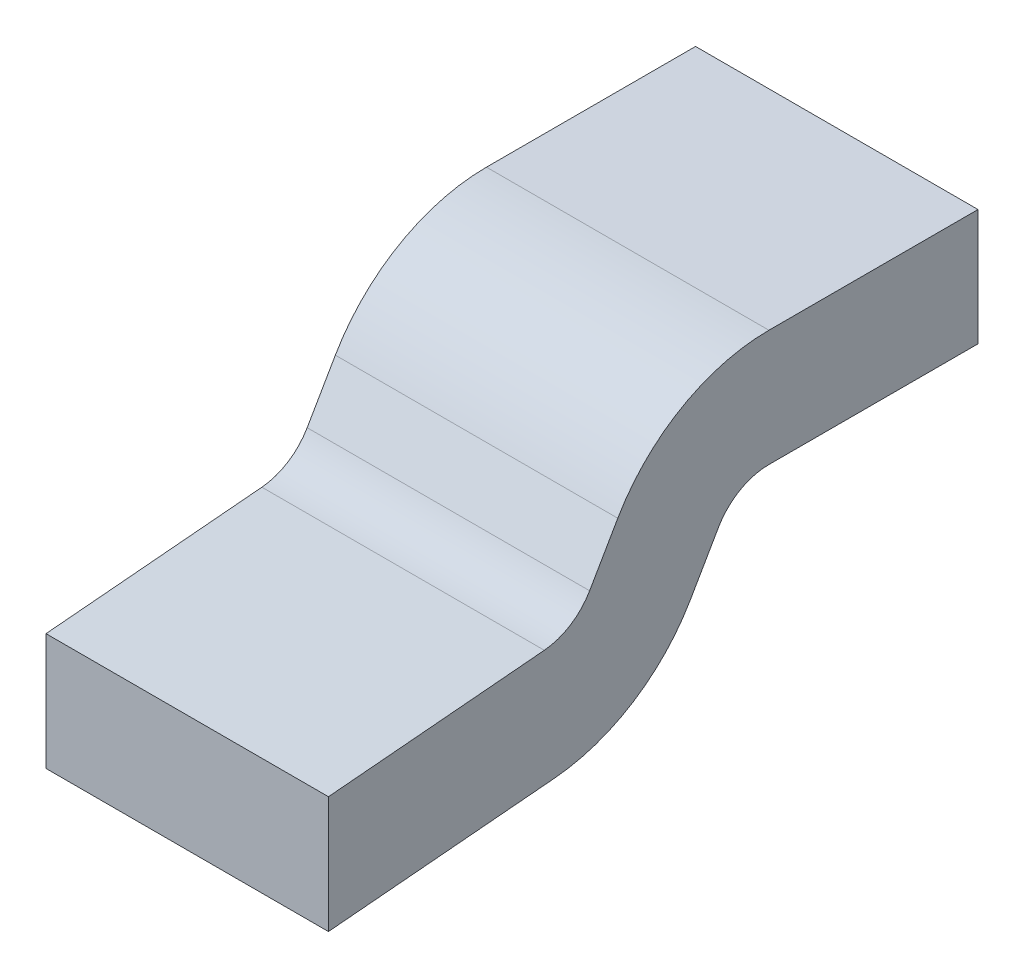
ISO-10303-21;
HEADER;
FILE_DESCRIPTION(('STEP AP214'),'2;1');
FILE_NAME('part.step','',(''),(''),'','','');
FILE_SCHEMA(('AUTOMOTIVE_DESIGN { 1 0 10303 214 1 1 1 1 }'));
ENDSEC;
DATA;
#1=APPLICATION_CONTEXT('core data for automotive mechanical design processes');
#2=APPLICATION_PROTOCOL_DEFINITION('international standard','automotive_design',2000,#1);
#3=PRODUCT_CONTEXT('',#1,'mechanical');
#4=PRODUCT('Part','Part','',(#3));
#5=PRODUCT_RELATED_PRODUCT_CATEGORY('part','',(#4));
#6=PRODUCT_DEFINITION_FORMATION('','',#4);
#7=PRODUCT_DEFINITION_CONTEXT('part definition',#1,'design');
#8=PRODUCT_DEFINITION('design','',#6,#7);
#9=PRODUCT_DEFINITION_SHAPE('','',#8);
#10=(LENGTH_UNIT() NAMED_UNIT(*) SI_UNIT(.MILLI.,.METRE.));
#11=(NAMED_UNIT(*) PLANE_ANGLE_UNIT() SI_UNIT($,.RADIAN.));
#12=(NAMED_UNIT(*) SI_UNIT($,.STERADIAN.) SOLID_ANGLE_UNIT());
#13=UNCERTAINTY_MEASURE_WITH_UNIT(LENGTH_MEASURE(1.E-05),#10,'distance_accuracy_value','');
#14=(GEOMETRIC_REPRESENTATION_CONTEXT(3) GLOBAL_UNCERTAINTY_ASSIGNED_CONTEXT((#13)) GLOBAL_UNIT_ASSIGNED_CONTEXT((#10,
#11,#12)) REPRESENTATION_CONTEXT('',''));
#15=CARTESIAN_POINT('',(0.,0.,0.));
#16=DIRECTION('',(0.,0.,1.));
#17=DIRECTION('',(1.,0.,0.));
#18=AXIS2_PLACEMENT_3D('',#15,#16,#17);
#19=CARTESIAN_POINT('',(-0.37,-0.22,0.9144));
#20=DIRECTION('',(0.,-0.996194698091747,-0.0871557427476379));
#21=DIRECTION('',(0.,0.0871557427476379,-0.996194698091747));
#22=AXIS2_PLACEMENT_3D('',#19,#20,#21);
#23=PLANE('',#22);
#24=DIRECTION('',(0.,0.0871557427476379,-0.996194698091747));
#25=VECTOR('',#24,1.);
#26=CARTESIAN_POINT('',(-0.37,-0.22,0.9144));
#27=LINE('',#26,#25);
#28=CARTESIAN_POINT('',(-0.37,-0.22,0.9144));
#29=VERTEX_POINT('',#28);
#30=CARTESIAN_POINT('',(-0.37,-0.168191562178,0.322226845968));
#31=VERTEX_POINT('',#30);
#32=EDGE_CURVE('E138',#29,#31,#27,.T.);
#33=ORIENTED_EDGE('',*,*,#32,.T.);
#34=DIRECTION('',(1.,0.,0.));
#35=VECTOR('',#34,1.);
#36=CARTESIAN_POINT('',(-0.37,-0.168191562178,0.322226845968));
#37=LINE('',#36,#35);
#38=CARTESIAN_POINT('',(0.37,-0.168191562178,0.322226845968));
#39=VERTEX_POINT('',#38);
#40=EDGE_CURVE('E11',#31,#39,#37,.T.);
#41=ORIENTED_EDGE('',*,*,#40,.T.);
#42=DIRECTION('',(0.,0.0871557427476379,-0.996194698091747));
#43=VECTOR('',#42,1.);
#44=CARTESIAN_POINT('',(0.37,-0.22,0.9144));
#45=LINE('',#44,#43);
#46=CARTESIAN_POINT('',(0.37,-0.22,0.9144));
#47=VERTEX_POINT('',#46);
#48=EDGE_CURVE('E235',#47,#39,#45,.T.);
#49=ORIENTED_EDGE('',*,*,#48,.F.);
#50=DIRECTION('',(1.,0.,0.));
#51=VECTOR('',#50,1.);
#52=CARTESIAN_POINT('',(-0.37,-0.22,0.9144));
#53=LINE('',#52,#51);
#54=EDGE_CURVE('E140',#29,#47,#53,.T.);
#55=ORIENTED_EDGE('',*,*,#54,.F.);
#56=EDGE_LOOP('',(#33,#41,#49,#55));
#57=FACE_BOUND('',#56,.T.);
#58=ADVANCED_FACE('F17',(#57),#23,.T.);
#59=CARTESIAN_POINT('',(-0.37,0.28726865379,0.362074451552));
#60=DIRECTION('',(-1.,0.,0.));
#61=DIRECTION('',(0.,-0.50000000000019,-0.866025403784329));
#62=AXIS2_PLACEMENT_3D('',#59,#60,#61);
#63=CYLINDRICAL_SURFACE('',#62,0.4572);
#64=CARTESIAN_POINT('',(0.37,0.28726865379,0.362074451552));
#65=DIRECTION('',(-1.,0.,0.));
#66=DIRECTION('',(0.,-0.50000000000019,-0.866025403784329));
#67=AXIS2_PLACEMENT_3D('',#64,#65,#66);
#68=CIRCLE('',#67,0.4572);
#69=CARTESIAN_POINT('',(0.37,0.05866865378978,-0.03387236305852));
#70=VERTEX_POINT('',#69);
#71=EDGE_CURVE('E25',#70,#39,#68,.T.);
#72=ORIENTED_EDGE('',*,*,#71,.T.);
#73=ORIENTED_EDGE('',*,*,#40,.F.);
#74=CARTESIAN_POINT('',(-0.37,0.28726865379,0.362074451552));
#75=DIRECTION('',(-1.,0.,0.));
#76=DIRECTION('',(0.,-0.50000000000019,-0.866025403784329));
#77=AXIS2_PLACEMENT_3D('',#74,#75,#76);
#78=CIRCLE('',#77,0.4572);
#79=CARTESIAN_POINT('',(-0.37,0.05866865378978,-0.03387236305852));
#80=VERTEX_POINT('',#79);
#81=EDGE_CURVE('E135',#80,#31,#78,.T.);
#82=ORIENTED_EDGE('',*,*,#81,.F.);
#83=DIRECTION('',(1.,0.,0.));
#84=VECTOR('',#83,1.);
#85=CARTESIAN_POINT('',(-0.37,0.05866865378978,-0.03387236305852));
#86=LINE('',#85,#84);
#87=EDGE_CURVE('E229',#80,#70,#86,.T.);
#88=ORIENTED_EDGE('',*,*,#87,.T.);
#89=EDGE_LOOP('',(#72,#73,#82,#88));
#90=FACE_BOUND('',#89,.T.);
#91=ADVANCED_FACE('F132',(#90),#63,.T.);
#92=CARTESIAN_POINT('',(0.37,0.,0.));
#93=DIRECTION('',(1.,0.,0.));
#94=DIRECTION('',(0.,1.,0.));
#95=AXIS2_PLACEMENT_3D('',#92,#93,#94);
#96=PLANE('',#95);
#97=ORIENTED_EDGE('',*,*,#48,.T.);
#98=ORIENTED_EDGE('',*,*,#71,.F.);
#99=DIRECTION('',(0.,0.866025403784329,-0.50000000000019));
#100=VECTOR('',#99,1.);
#101=CARTESIAN_POINT('',(0.37,0.05866865378978,-0.03387236305852));
#102=LINE('',#101,#100);
#103=CARTESIAN_POINT('',(0.37,0.1864,-0.107618090177));
#104=VERTEX_POINT('',#103);
#105=EDGE_CURVE('E232',#70,#104,#102,.T.);
#106=ORIENTED_EDGE('',*,*,#105,.T.);
#107=CARTESIAN_POINT('',(0.37,0.1102,-0.239600361714));
#108=DIRECTION('',(1.,0.,0.));
#109=DIRECTION('',(0.,1.,0.));
#110=AXIS2_PLACEMENT_3D('',#107,#108,#109);
#111=CIRCLE('',#110,0.1524);
#112=CARTESIAN_POINT('',(0.37,0.2626,-0.239600361714));
#113=VERTEX_POINT('',#112);
#114=EDGE_CURVE('E215',#113,#104,#111,.T.);
#115=ORIENTED_EDGE('',*,*,#114,.F.);
#116=DIRECTION('',(0.,0.,-1.));
#117=VECTOR('',#116,1.);
#118=CARTESIAN_POINT('',(0.37,0.2626,-0.239600361714));
#119=LINE('',#118,#117);
#120=CARTESIAN_POINT('',(0.37,0.2626,-0.7874));
#121=VERTEX_POINT('',#120);
#122=EDGE_CURVE('E216',#113,#121,#119,.T.);
#123=ORIENTED_EDGE('',*,*,#122,.T.);
#124=DIRECTION('',(0.,1.,0.));
#125=VECTOR('',#124,1.);
#126=CARTESIAN_POINT('',(0.37,0.2626,-0.7874));
#127=LINE('',#126,#125);
#128=CARTESIAN_POINT('',(0.37,0.5674,-0.7874));
#129=VERTEX_POINT('',#128);
#130=EDGE_CURVE('E207',#121,#129,#127,.T.);
#131=ORIENTED_EDGE('',*,*,#130,.T.);
#132=DIRECTION('',(0.,0.,1.));
#133=VECTOR('',#132,1.);
#134=CARTESIAN_POINT('',(0.37,0.5674,-0.7874));
#135=LINE('',#134,#133);
#136=CARTESIAN_POINT('',(0.37,0.5674,-0.239600361714));
#137=VERTEX_POINT('',#136);
#138=EDGE_CURVE('E182',#129,#137,#135,.T.);
#139=ORIENTED_EDGE('',*,*,#138,.T.);
#140=CARTESIAN_POINT('',(0.37,0.1102,-0.239600361714));
#141=DIRECTION('',(-1.,0.,0.));
#142=DIRECTION('',(0.,0.50000000000019,0.866025403784329));
#143=AXIS2_PLACEMENT_3D('',#140,#141,#142);
#144=CIRCLE('',#143,0.4572);
#145=CARTESIAN_POINT('',(0.37,0.3388,0.156346452897));
#146=VERTEX_POINT('',#145);
#147=EDGE_CURVE('E183',#146,#137,#144,.T.);
#148=ORIENTED_EDGE('',*,*,#147,.F.);
#149=DIRECTION('',(0.,-0.866025403784329,0.50000000000019));
#150=VECTOR('',#149,1.);
#151=CARTESIAN_POINT('',(0.37,0.3388,0.156346452897));
#152=LINE('',#151,#150);
#153=CARTESIAN_POINT('',(0.37,0.21106865379,0.230092180015));
#154=VERTEX_POINT('',#153);
#155=EDGE_CURVE('E191',#146,#154,#152,.T.);
#156=ORIENTED_EDGE('',*,*,#155,.T.);
#157=CARTESIAN_POINT('',(0.37,0.28726865379,0.362074451552));
#158=DIRECTION('',(1.,0.,0.));
#159=DIRECTION('',(0.,-0.996194698091747,-0.0871557427476379));
#160=AXIS2_PLACEMENT_3D('',#157,#158,#159);
#161=CIRCLE('',#160,0.1524);
#162=CARTESIAN_POINT('',(0.37,0.135448581801,0.348791916357));
#163=VERTEX_POINT('',#162);
#164=EDGE_CURVE('E175',#163,#154,#161,.T.);
#165=ORIENTED_EDGE('',*,*,#164,.F.);
#166=DIRECTION('',(0.,-0.0871557427476379,0.996194698091747));
#167=VECTOR('',#166,1.);
#168=CARTESIAN_POINT('',(0.37,0.135448581801,0.348791916357));
#169=LINE('',#168,#167);
#170=CARTESIAN_POINT('',(0.37,0.08596428648321,0.9144));
#171=VERTEX_POINT('',#170);
#172=EDGE_CURVE('E176',#163,#171,#169,.T.);
#173=ORIENTED_EDGE('',*,*,#172,.T.);
#174=DIRECTION('',(0.,1.,0.));
#175=VECTOR('',#174,1.);
#176=CARTESIAN_POINT('',(0.37,-0.22,0.9144));
#177=LINE('',#176,#175);
#178=EDGE_CURVE('E166',#47,#171,#177,.T.);
#179=ORIENTED_EDGE('',*,*,#178,.F.);
#180=EDGE_LOOP('',(#97,#98,#106,#115,#123,#131,#139,#148,#156,#165,#173,#179));
#181=FACE_BOUND('',#180,.T.);
#182=ADVANCED_FACE('F254',(#181),#96,.T.);
#183=CARTESIAN_POINT('',(-0.37,-0.147448211667,0.08512926469761));
#184=DIRECTION('',(0.,-0.50000000000019,-0.866025403784329));
#185=DIRECTION('',(0.,-0.866025403784329,0.50000000000019));
#186=AXIS2_PLACEMENT_3D('',#183,#184,#185);
#187=PLANE('',#186);
#188=ORIENTED_EDGE('',*,*,#87,.F.);
#189=DIRECTION('',(0.,-0.866025403784329,0.50000000000019));
#190=VECTOR('',#189,1.);
#191=CARTESIAN_POINT('',(-0.37,0.1864,-0.107618090177));
#192=LINE('',#191,#190);
#193=CARTESIAN_POINT('',(-0.37,0.1864,-0.107618090177));
#194=VERTEX_POINT('',#193);
#195=EDGE_CURVE('E151',#194,#80,#192,.T.);
#196=ORIENTED_EDGE('',*,*,#195,.F.);
#197=DIRECTION('',(1.,0.,0.));
#198=VECTOR('',#197,1.);
#199=CARTESIAN_POINT('',(-0.37,0.1864,-0.107618090177));
#200=LINE('',#199,#198);
#201=EDGE_CURVE('E225',#194,#104,#200,.T.);
#202=ORIENTED_EDGE('',*,*,#201,.T.);
#203=ORIENTED_EDGE('',*,*,#105,.F.);
#204=EDGE_LOOP('',(#188,#196,#202,#203));
#205=FACE_BOUND('',#204,.T.);
#206=ADVANCED_FACE('F259',(#205),#187,.T.);
#207=CARTESIAN_POINT('',(-0.37,0.1102,-0.239600361714));
#208=DIRECTION('',(1.,0.,0.));
#209=DIRECTION('',(0.,1.,0.));
#210=AXIS2_PLACEMENT_3D('',#207,#208,#209);
#211=CYLINDRICAL_SURFACE('',#210,0.1524);
#212=ORIENTED_EDGE('',*,*,#114,.T.);
#213=ORIENTED_EDGE('',*,*,#201,.F.);
#214=CARTESIAN_POINT('',(-0.37,0.1102,-0.239600361714));
#215=DIRECTION('',(1.,0.,0.));
#216=DIRECTION('',(0.,1.,0.));
#217=AXIS2_PLACEMENT_3D('',#214,#215,#216);
#218=CIRCLE('',#217,0.1524);
#219=CARTESIAN_POINT('',(-0.37,0.2626,-0.239600361714));
#220=VERTEX_POINT('',#219);
#221=EDGE_CURVE('E158',#220,#194,#218,.T.);
#222=ORIENTED_EDGE('',*,*,#221,.F.);
#223=DIRECTION('',(1.,0.,0.));
#224=VECTOR('',#223,1.);
#225=CARTESIAN_POINT('',(-0.37,0.2626,-0.239600361714));
#226=LINE('',#225,#224);
#227=EDGE_CURVE('E211',#220,#113,#226,.T.);
#228=ORIENTED_EDGE('',*,*,#227,.T.);
#229=EDGE_LOOP('',(#212,#213,#222,#228));
#230=FACE_BOUND('',#229,.T.);
#231=ADVANCED_FACE('F271',(#230),#211,.F.);
#232=CARTESIAN_POINT('',(-0.37,0.2626,-0.151612180689));
#233=DIRECTION('',(0.,-1.,0.));
#234=DIRECTION('',(0.,0.,-1.));
#235=AXIS2_PLACEMENT_3D('',#232,#233,#234);
#236=PLANE('',#235);
#237=DIRECTION('',(1.,0.,0.));
#238=VECTOR('',#237,1.);
#239=CARTESIAN_POINT('',(-0.37,0.2626,-0.7874));
#240=LINE('',#239,#238);
#241=CARTESIAN_POINT('',(-0.37,0.2626,-0.7874));
#242=VERTEX_POINT('',#241);
#243=EDGE_CURVE('E210',#242,#121,#240,.T.);
#244=ORIENTED_EDGE('',*,*,#243,.T.);
#245=ORIENTED_EDGE('',*,*,#122,.F.);
#246=ORIENTED_EDGE('',*,*,#227,.F.);
#247=DIRECTION('',(0.,0.,-1.));
#248=VECTOR('',#247,1.);
#249=CARTESIAN_POINT('',(-0.37,0.2626,-0.239600361714));
#250=LINE('',#249,#248);
#251=EDGE_CURVE('E165',#220,#242,#250,.T.);
#252=ORIENTED_EDGE('',*,*,#251,.T.);
#253=EDGE_LOOP('',(#244,#245,#246,#252));
#254=FACE_BOUND('',#253,.T.);
#255=ADVANCED_FACE('F265',(#254),#236,.T.);
#256=CARTESIAN_POINT('',(-0.37,0.2626,-0.7874));
#257=DIRECTION('',(0.,0.,-1.));
#258=DIRECTION('',(0.,-1.,0.));
#259=AXIS2_PLACEMENT_3D('',#256,#257,#258);
#260=PLANE('',#259);
#261=DIRECTION('',(1.,0.,0.));
#262=VECTOR('',#261,1.);
#263=CARTESIAN_POINT('',(-0.37,0.5674,-0.7874));
#264=LINE('',#263,#262);
#265=CARTESIAN_POINT('',(-0.37,0.5674,-0.7874));
#266=VERTEX_POINT('',#265);
#267=EDGE_CURVE('E203',#266,#129,#264,.T.);
#268=ORIENTED_EDGE('',*,*,#267,.T.);
#269=ORIENTED_EDGE('',*,*,#130,.F.);
#270=ORIENTED_EDGE('',*,*,#243,.F.);
#271=DIRECTION('',(0.,1.,0.));
#272=VECTOR('',#271,1.);
#273=CARTESIAN_POINT('',(-0.37,0.2626,-0.7874));
#274=LINE('',#273,#272);
#275=EDGE_CURVE('E416',#242,#266,#274,.T.);
#276=ORIENTED_EDGE('',*,*,#275,.T.);
#277=EDGE_LOOP('',(#268,#269,#270,#276));
#278=FACE_BOUND('',#277,.T.);
#279=ADVANCED_FACE('F270',(#278),#260,.T.);
#280=CARTESIAN_POINT('',(-0.37,0.5674,-0.7874));
#281=DIRECTION('',(0.,1.,0.));
#282=DIRECTION('',(1.,0.,0.));
#283=AXIS2_PLACEMENT_3D('',#280,#281,#282);
#284=PLANE('',#283);
#285=DIRECTION('',(1.,0.,0.));
#286=VECTOR('',#285,1.);
#287=CARTESIAN_POINT('',(-0.37,0.5674,-0.239600361714));
#288=LINE('',#287,#286);
#289=CARTESIAN_POINT('',(-0.37,0.5674,-0.239600361714));
#290=VERTEX_POINT('',#289);
#291=EDGE_CURVE('E178',#290,#137,#288,.T.);
#292=ORIENTED_EDGE('',*,*,#291,.T.);
#293=ORIENTED_EDGE('',*,*,#138,.F.);
#294=ORIENTED_EDGE('',*,*,#267,.F.);
#295=DIRECTION('',(0.,0.,1.));
#296=VECTOR('',#295,1.);
#297=CARTESIAN_POINT('',(-0.37,0.5674,-0.7874));
#298=LINE('',#297,#296);
#299=EDGE_CURVE('E389',#266,#290,#298,.T.);
#300=ORIENTED_EDGE('',*,*,#299,.T.);
#301=EDGE_LOOP('',(#292,#293,#294,#300));
#302=FACE_BOUND('',#301,.T.);
#303=ADVANCED_FACE('F317',(#302),#284,.T.);
#304=CARTESIAN_POINT('',(-0.37,0.1102,-0.239600361714));
#305=DIRECTION('',(-1.,0.,0.));
#306=DIRECTION('',(0.,0.50000000000019,0.866025403784329));
#307=AXIS2_PLACEMENT_3D('',#304,#305,#306);
#308=CYLINDRICAL_SURFACE('',#307,0.4572);
#309=ORIENTED_EDGE('',*,*,#147,.T.);
#310=ORIENTED_EDGE('',*,*,#291,.F.);
#311=CARTESIAN_POINT('',(-0.37,0.1102,-0.239600361714));
#312=DIRECTION('',(-1.,0.,0.));
#313=DIRECTION('',(0.,0.50000000000019,0.866025403784329));
#314=AXIS2_PLACEMENT_3D('',#311,#312,#313);
#315=CIRCLE('',#314,0.4572);
#316=CARTESIAN_POINT('',(-0.37,0.3388,0.156346452897));
#317=VERTEX_POINT('',#316);
#318=EDGE_CURVE('E393',#317,#290,#315,.T.);
#319=ORIENTED_EDGE('',*,*,#318,.F.);
#320=DIRECTION('',(1.,0.,0.));
#321=VECTOR('',#320,1.);
#322=CARTESIAN_POINT('',(-0.37,0.3388,0.156346452897));
#323=LINE('',#322,#321);
#324=EDGE_CURVE('E194',#317,#146,#323,.T.);
#325=ORIENTED_EDGE('',*,*,#324,.T.);
#326=EDGE_LOOP('',(#309,#310,#319,#325));
#327=FACE_BOUND('',#326,.T.);
#328=ADVANCED_FACE('F308',(#327),#308,.T.);
#329=CARTESIAN_POINT('',(-0.37,0.1524,0.263964543073));
#330=DIRECTION('',(0.,0.50000000000019,0.866025403784329));
#331=DIRECTION('',(1.,0.,0.));
#332=AXIS2_PLACEMENT_3D('',#329,#330,#331);
#333=PLANE('',#332);
#334=DIRECTION('',(1.,0.,0.));
#335=VECTOR('',#334,1.);
#336=CARTESIAN_POINT('',(-0.37,0.21106865379,0.230092180015));
#337=LINE('',#336,#335);
#338=CARTESIAN_POINT('',(-0.37,0.21106865379,0.230092180015));
#339=VERTEX_POINT('',#338);
#340=EDGE_CURVE('E187',#339,#154,#337,.T.);
#341=ORIENTED_EDGE('',*,*,#340,.T.);
#342=ORIENTED_EDGE('',*,*,#155,.F.);
#343=ORIENTED_EDGE('',*,*,#324,.F.);
#344=DIRECTION('',(0.,0.866025403784329,-0.50000000000019));
#345=VECTOR('',#344,1.);
#346=CARTESIAN_POINT('',(-0.37,0.21106865379,0.230092180015));
#347=LINE('',#346,#345);
#348=EDGE_CURVE('E411',#339,#317,#347,.T.);
#349=ORIENTED_EDGE('',*,*,#348,.F.);
#350=EDGE_LOOP('',(#341,#342,#343,#349));
#351=FACE_BOUND('',#350,.T.);
#352=ADVANCED_FACE('F299',(#351),#333,.T.);
#353=CARTESIAN_POINT('',(-0.37,0.28726865379,0.362074451552));
#354=DIRECTION('',(1.,0.,0.));
#355=DIRECTION('',(0.,-0.996194698091747,-0.0871557427476379));
#356=AXIS2_PLACEMENT_3D('',#353,#354,#355);
#357=CYLINDRICAL_SURFACE('',#356,0.1524);
#358=ORIENTED_EDGE('',*,*,#164,.T.);
#359=ORIENTED_EDGE('',*,*,#340,.F.);
#360=CARTESIAN_POINT('',(-0.37,0.28726865379,0.362074451552));
#361=DIRECTION('',(1.,0.,0.));
#362=DIRECTION('',(0.,-0.996194698091747,-0.0871557427476379));
#363=AXIS2_PLACEMENT_3D('',#360,#361,#362);
#364=CIRCLE('',#363,0.1524);
#365=CARTESIAN_POINT('',(-0.37,0.135448581801,0.348791916357));
#366=VERTEX_POINT('',#365);
#367=EDGE_CURVE('E401',#366,#339,#364,.T.);
#368=ORIENTED_EDGE('',*,*,#367,.F.);
#369=DIRECTION('',(1.,0.,0.));
#370=VECTOR('',#369,1.);
#371=CARTESIAN_POINT('',(-0.37,0.135448581801,0.348791916357));
#372=LINE('',#371,#370);
#373=EDGE_CURVE('E172',#366,#163,#372,.T.);
#374=ORIENTED_EDGE('',*,*,#373,.T.);
#375=EDGE_LOOP('',(#358,#359,#368,#374));
#376=FACE_BOUND('',#375,.T.);
#377=ADVANCED_FACE('F290',(#376),#357,.F.);
#378=CARTESIAN_POINT('',(-0.37,0.142363031971,0.269759389267));
#379=DIRECTION('',(0.,0.996194698091747,0.0871557427476379));
#380=DIRECTION('',(1.,0.,0.));
#381=AXIS2_PLACEMENT_3D('',#378,#379,#380);
#382=PLANE('',#381);
#383=ORIENTED_EDGE('',*,*,#172,.F.);
#384=ORIENTED_EDGE('',*,*,#373,.F.);
#385=DIRECTION('',(0.,-0.0871557427476379,0.996194698091747));
#386=VECTOR('',#385,1.);
#387=CARTESIAN_POINT('',(-0.37,0.135448581801,0.348791916357));
#388=LINE('',#387,#386);
#389=CARTESIAN_POINT('',(-0.37,0.08596428648321,0.9144));
#390=VERTEX_POINT('',#389);
#391=EDGE_CURVE('E424',#366,#390,#388,.T.);
#392=ORIENTED_EDGE('',*,*,#391,.T.);
#393=DIRECTION('',(1.,0.,0.));
#394=VECTOR('',#393,1.);
#395=CARTESIAN_POINT('',(-0.37,0.08596428648321,0.9144));
#396=LINE('',#395,#394);
#397=EDGE_CURVE('E162',#390,#171,#396,.T.);
#398=ORIENTED_EDGE('',*,*,#397,.T.);
#399=EDGE_LOOP('',(#383,#384,#392,#398));
#400=FACE_BOUND('',#399,.T.);
#401=ADVANCED_FACE('F281',(#400),#382,.T.);
#402=CARTESIAN_POINT('',(0.444,-0.22,0.9144));
#403=DIRECTION('',(0.,0.,-1.));
#404=DIRECTION('',(0.,-1.,0.));
#405=AXIS2_PLACEMENT_3D('',#402,#403,#404);
#406=PLANE('',#405);
#407=ORIENTED_EDGE('',*,*,#54,.T.);
#408=ORIENTED_EDGE('',*,*,#178,.T.);
#409=ORIENTED_EDGE('',*,*,#397,.F.);
#410=DIRECTION('',(0.,1.,0.));
#411=VECTOR('',#410,1.);
#412=CARTESIAN_POINT('',(-0.37,-0.22,0.9144));
#413=LINE('',#412,#411);
#414=EDGE_CURVE('E145',#29,#390,#413,.T.);
#415=ORIENTED_EDGE('',*,*,#414,.F.);
#416=EDGE_LOOP('',(#407,#408,#409,#415));
#417=FACE_BOUND('',#416,.T.);
#418=ADVANCED_FACE('F248',(#417),#406,.F.);
#419=CARTESIAN_POINT('',(-0.37,0.,0.));
#420=DIRECTION('',(1.,0.,0.));
#421=DIRECTION('',(0.,1.,0.));
#422=AXIS2_PLACEMENT_3D('',#419,#420,#421);
#423=PLANE('',#422);
#424=ORIENTED_EDGE('',*,*,#391,.F.);
#425=ORIENTED_EDGE('',*,*,#367,.T.);
#426=ORIENTED_EDGE('',*,*,#348,.T.);
#427=ORIENTED_EDGE('',*,*,#318,.T.);
#428=ORIENTED_EDGE('',*,*,#299,.F.);
#429=ORIENTED_EDGE('',*,*,#275,.F.);
#430=ORIENTED_EDGE('',*,*,#251,.F.);
#431=ORIENTED_EDGE('',*,*,#221,.T.);
#432=ORIENTED_EDGE('',*,*,#195,.T.);
#433=ORIENTED_EDGE('',*,*,#81,.T.);
#434=ORIENTED_EDGE('',*,*,#32,.F.);
#435=ORIENTED_EDGE('',*,*,#414,.T.);
#436=EDGE_LOOP('',(#424,#425,#426,#427,#428,#429,#430,#431,#432,#433,#434,#435));
#437=FACE_BOUND('',#436,.T.);
#438=ADVANCED_FACE('F148',(#437),#423,.F.);
#439=CLOSED_SHELL('',(#58,#91,#182,#206,#231,#255,#279,#303,#328,#352,#377,#401,#418,#438));
#440=MANIFOLD_SOLID_BREP('B1',#439);
#441=ADVANCED_BREP_SHAPE_REPRESENTATION('',(#18,#440),#14);
#442=SHAPE_DEFINITION_REPRESENTATION(#9,#441);
ENDSEC;
END-ISO-10303-21;
